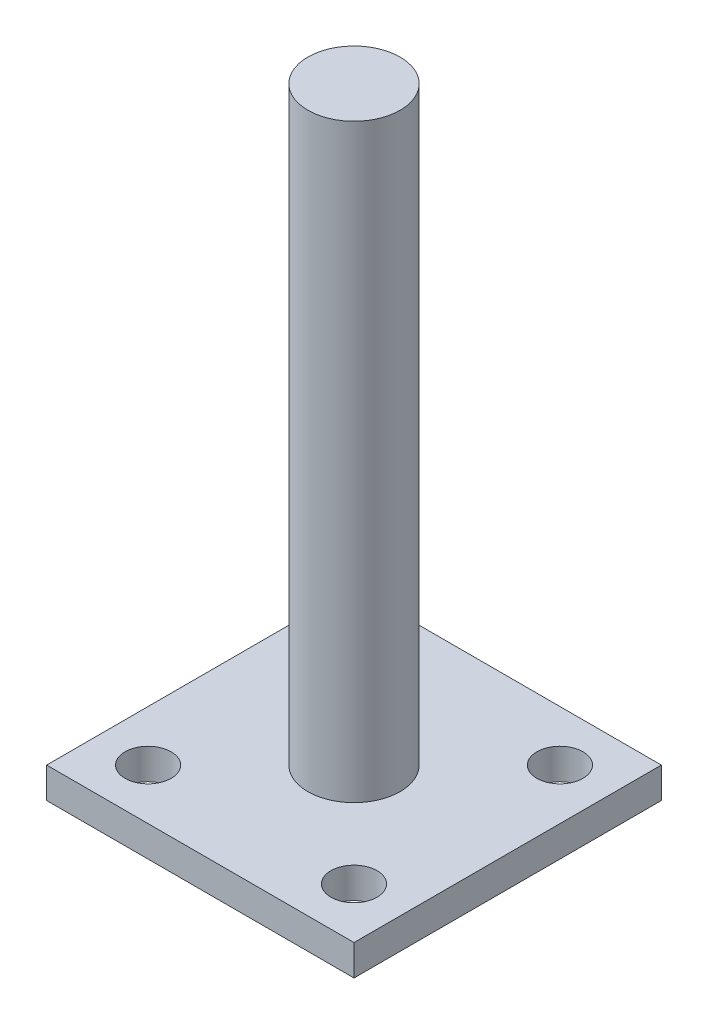
ISO-10303-21;
HEADER;
FILE_DESCRIPTION(('STEP AP214'),'2;1');
FILE_NAME('part.step','',(''),(''),'','','');
FILE_SCHEMA(('AUTOMOTIVE_DESIGN { 1 0 10303 214 1 1 1 1 }'));
ENDSEC;
DATA;
#1=APPLICATION_CONTEXT('core data for automotive mechanical design processes');
#2=APPLICATION_PROTOCOL_DEFINITION('international standard','automotive_design',2000,#1);
#3=PRODUCT_CONTEXT('',#1,'mechanical');
#4=PRODUCT('Part','Part','',(#3));
#5=PRODUCT_RELATED_PRODUCT_CATEGORY('part','',(#4));
#6=PRODUCT_DEFINITION_FORMATION('','',#4);
#7=PRODUCT_DEFINITION_CONTEXT('part definition',#1,'design');
#8=PRODUCT_DEFINITION('design','',#6,#7);
#9=PRODUCT_DEFINITION_SHAPE('','',#8);
#10=(LENGTH_UNIT() NAMED_UNIT(*) SI_UNIT(.MILLI.,.METRE.));
#11=(NAMED_UNIT(*) PLANE_ANGLE_UNIT() SI_UNIT($,.RADIAN.));
#12=(NAMED_UNIT(*) SI_UNIT($,.STERADIAN.) SOLID_ANGLE_UNIT());
#13=UNCERTAINTY_MEASURE_WITH_UNIT(LENGTH_MEASURE(1.E-05),#10,'distance_accuracy_value','');
#14=(GEOMETRIC_REPRESENTATION_CONTEXT(3) GLOBAL_UNCERTAINTY_ASSIGNED_CONTEXT((#13)) GLOBAL_UNIT_ASSIGNED_CONTEXT((#10,
#11,#12)) REPRESENTATION_CONTEXT('',''));
#15=CARTESIAN_POINT('',(0.,0.,0.));
#16=DIRECTION('',(0.,0.,1.));
#17=DIRECTION('',(1.,0.,0.));
#18=AXIS2_PLACEMENT_3D('',#15,#16,#17);
#19=CARTESIAN_POINT('',(0.,10.,0.));
#20=DIRECTION('',(0.,-1.,0.));
#21=DIRECTION('',(0.,0.,-1.));
#22=AXIS2_PLACEMENT_3D('',#19,#20,#21);
#23=PLANE('',#22);
#24=CARTESIAN_POINT('',(0.,10.,0.));
#25=DIRECTION('',(0.,1.,0.));
#26=DIRECTION('',(0.,0.,1.));
#27=AXIS2_PLACEMENT_3D('',#24,#25,#26);
#28=CIRCLE('',#27,15.);
#29=CARTESIAN_POINT('',(0.,10.,15.));
#30=VERTEX_POINT('',#29);
#31=EDGE_CURVE('E11',#30,#30,#28,.T.);
#32=ORIENTED_EDGE('',*,*,#31,.F.);
#33=EDGE_LOOP('',(#32));
#34=FACE_BOUND('',#33,.T.);
#35=DIRECTION('',(0.,0.,1.));
#36=VECTOR('',#35,1.);
#37=CARTESIAN_POINT('',(-50.,10.,-50.));
#38=LINE('',#37,#36);
#39=CARTESIAN_POINT('',(-50.,10.,-50.));
#40=VERTEX_POINT('',#39);
#41=CARTESIAN_POINT('',(-50.,10.,50.));
#42=VERTEX_POINT('',#41);
#43=EDGE_CURVE('E91',#40,#42,#38,.T.);
#44=ORIENTED_EDGE('',*,*,#43,.T.);
#45=DIRECTION('',(1.,0.,0.));
#46=VECTOR('',#45,1.);
#47=CARTESIAN_POINT('',(50.,10.,50.));
#48=LINE('',#47,#46);
#49=CARTESIAN_POINT('',(50.,10.,50.));
#50=VERTEX_POINT('',#49);
#51=EDGE_CURVE('E86',#42,#50,#48,.T.);
#52=ORIENTED_EDGE('',*,*,#51,.T.);
#53=DIRECTION('',(0.,0.,-1.));
#54=VECTOR('',#53,1.);
#55=CARTESIAN_POINT('',(50.,10.,-50.));
#56=LINE('',#55,#54);
#57=CARTESIAN_POINT('',(50.,10.,-50.));
#58=VERTEX_POINT('',#57);
#59=EDGE_CURVE('E89',#50,#58,#56,.T.);
#60=ORIENTED_EDGE('',*,*,#59,.T.);
#61=DIRECTION('',(-1.,0.,0.));
#62=VECTOR('',#61,1.);
#63=CARTESIAN_POINT('',(50.,10.,-50.));
#64=LINE('',#63,#62);
#65=EDGE_CURVE('E55',#58,#40,#64,.T.);
#66=ORIENTED_EDGE('',*,*,#65,.T.);
#67=EDGE_LOOP('',(#44,#52,#60,#66));
#68=FACE_BOUND('',#67,.T.);
#69=CARTESIAN_POINT('',(33.5,10.,-33.5));
#70=DIRECTION('',(0.,1.,0.));
#71=DIRECTION('',(0.,0.,1.));
#72=AXIS2_PLACEMENT_3D('',#69,#70,#71);
#73=CIRCLE('',#72,7.5);
#74=CARTESIAN_POINT('',(33.5,10.,-26.));
#75=VERTEX_POINT('',#74);
#76=EDGE_CURVE('E107',#75,#75,#73,.T.);
#77=ORIENTED_EDGE('',*,*,#76,.F.);
#78=EDGE_LOOP('',(#77));
#79=FACE_BOUND('',#78,.T.);
#80=CARTESIAN_POINT('',(-33.5,10.,-33.5));
#81=DIRECTION('',(0.,1.,0.));
#82=DIRECTION('',(0.,0.,1.));
#83=AXIS2_PLACEMENT_3D('',#80,#81,#82);
#84=CIRCLE('',#83,7.5);
#85=CARTESIAN_POINT('',(-33.5,10.,-26.));
#86=VERTEX_POINT('',#85);
#87=EDGE_CURVE('E122',#86,#86,#84,.T.);
#88=ORIENTED_EDGE('',*,*,#87,.F.);
#89=EDGE_LOOP('',(#88));
#90=FACE_BOUND('',#89,.T.);
#91=CARTESIAN_POINT('',(-33.5,10.,33.5));
#92=DIRECTION('',(0.,1.,0.));
#93=DIRECTION('',(0.,0.,1.));
#94=AXIS2_PLACEMENT_3D('',#91,#92,#93);
#95=CIRCLE('',#94,7.5);
#96=CARTESIAN_POINT('',(-33.5,10.,41.));
#97=VERTEX_POINT('',#96);
#98=EDGE_CURVE('E128',#97,#97,#95,.T.);
#99=ORIENTED_EDGE('',*,*,#98,.F.);
#100=EDGE_LOOP('',(#99));
#101=FACE_BOUND('',#100,.T.);
#102=CARTESIAN_POINT('',(33.5,10.,33.5));
#103=DIRECTION('',(0.,1.,0.));
#104=DIRECTION('',(0.,0.,1.));
#105=AXIS2_PLACEMENT_3D('',#102,#103,#104);
#106=CIRCLE('',#105,7.5);
#107=CARTESIAN_POINT('',(33.5,10.,41.));
#108=VERTEX_POINT('',#107);
#109=EDGE_CURVE('E134',#108,#108,#106,.T.);
#110=ORIENTED_EDGE('',*,*,#109,.F.);
#111=EDGE_LOOP('',(#110));
#112=FACE_BOUND('',#111,.T.);
#113=ADVANCED_FACE('F37',(#34,#68,#79,#90,#101,#112),#23,.F.);
#114=CARTESIAN_POINT('',(0.,0.,0.));
#115=DIRECTION('',(0.,-1.,0.));
#116=DIRECTION('',(0.,0.,-1.));
#117=AXIS2_PLACEMENT_3D('',#114,#115,#116);
#118=PLANE('',#117);
#119=CARTESIAN_POINT('',(-33.5,0.,33.5));
#120=DIRECTION('',(0.,1.,0.));
#121=DIRECTION('',(0.,0.,1.));
#122=AXIS2_PLACEMENT_3D('',#119,#120,#121);
#123=CIRCLE('',#122,7.5);
#124=CARTESIAN_POINT('',(-33.5,0.,41.));
#125=VERTEX_POINT('',#124);
#126=EDGE_CURVE('E131',#125,#125,#123,.T.);
#127=ORIENTED_EDGE('',*,*,#126,.T.);
#128=EDGE_LOOP('',(#127));
#129=FACE_BOUND('',#128,.T.);
#130=CARTESIAN_POINT('',(33.5,0.,-33.5));
#131=DIRECTION('',(0.,1.,0.));
#132=DIRECTION('',(0.,0.,1.));
#133=AXIS2_PLACEMENT_3D('',#130,#131,#132);
#134=CIRCLE('',#133,7.5);
#135=CARTESIAN_POINT('',(33.5,0.,-26.));
#136=VERTEX_POINT('',#135);
#137=EDGE_CURVE('E119',#136,#136,#134,.T.);
#138=ORIENTED_EDGE('',*,*,#137,.T.);
#139=EDGE_LOOP('',(#138));
#140=FACE_BOUND('',#139,.T.);
#141=DIRECTION('',(0.,0.,1.));
#142=VECTOR('',#141,1.);
#143=CARTESIAN_POINT('',(-50.,0.,-50.));
#144=LINE('',#143,#142);
#145=CARTESIAN_POINT('',(-50.,0.,-50.));
#146=VERTEX_POINT('',#145);
#147=CARTESIAN_POINT('',(-50.,0.,50.));
#148=VERTEX_POINT('',#147);
#149=EDGE_CURVE('E104',#146,#148,#144,.T.);
#150=ORIENTED_EDGE('',*,*,#149,.F.);
#151=DIRECTION('',(-1.,0.,0.));
#152=VECTOR('',#151,1.);
#153=CARTESIAN_POINT('',(50.,0.,-50.));
#154=LINE('',#153,#152);
#155=CARTESIAN_POINT('',(50.,0.,-50.));
#156=VERTEX_POINT('',#155);
#157=EDGE_CURVE('E78',#156,#146,#154,.T.);
#158=ORIENTED_EDGE('',*,*,#157,.F.);
#159=DIRECTION('',(0.,0.,-1.));
#160=VECTOR('',#159,1.);
#161=CARTESIAN_POINT('',(50.,0.,-50.));
#162=LINE('',#161,#160);
#163=CARTESIAN_POINT('',(50.,0.,50.));
#164=VERTEX_POINT('',#163);
#165=EDGE_CURVE('E72',#164,#156,#162,.T.);
#166=ORIENTED_EDGE('',*,*,#165,.F.);
#167=DIRECTION('',(1.,0.,0.));
#168=VECTOR('',#167,1.);
#169=CARTESIAN_POINT('',(50.,0.,50.));
#170=LINE('',#169,#168);
#171=EDGE_CURVE('E96',#148,#164,#170,.T.);
#172=ORIENTED_EDGE('',*,*,#171,.F.);
#173=EDGE_LOOP('',(#150,#158,#166,#172));
#174=FACE_BOUND('',#173,.T.);
#175=CARTESIAN_POINT('',(-33.5,0.,-33.5));
#176=DIRECTION('',(0.,1.,0.));
#177=DIRECTION('',(0.,0.,1.));
#178=AXIS2_PLACEMENT_3D('',#175,#176,#177);
#179=CIRCLE('',#178,7.5);
#180=CARTESIAN_POINT('',(-33.5,0.,-26.));
#181=VERTEX_POINT('',#180);
#182=EDGE_CURVE('E125',#181,#181,#179,.T.);
#183=ORIENTED_EDGE('',*,*,#182,.T.);
#184=EDGE_LOOP('',(#183));
#185=FACE_BOUND('',#184,.T.);
#186=CARTESIAN_POINT('',(33.5,0.,33.5));
#187=DIRECTION('',(0.,1.,0.));
#188=DIRECTION('',(0.,0.,1.));
#189=AXIS2_PLACEMENT_3D('',#186,#187,#188);
#190=CIRCLE('',#189,7.5);
#191=CARTESIAN_POINT('',(33.5,0.,41.));
#192=VERTEX_POINT('',#191);
#193=EDGE_CURVE('E137',#192,#192,#190,.T.);
#194=ORIENTED_EDGE('',*,*,#193,.T.);
#195=EDGE_LOOP('',(#194));
#196=FACE_BOUND('',#195,.T.);
#197=ADVANCED_FACE('F115',(#129,#140,#174,#185,#196),#118,.T.);
#198=CARTESIAN_POINT('',(-50.,10.,-50.));
#199=DIRECTION('',(1.,0.,0.));
#200=DIRECTION('',(0.,0.,-1.));
#201=AXIS2_PLACEMENT_3D('',#198,#199,#200);
#202=PLANE('',#201);
#203=ORIENTED_EDGE('',*,*,#149,.T.);
#204=DIRECTION('',(0.,-1.,0.));
#205=VECTOR('',#204,1.);
#206=CARTESIAN_POINT('',(-50.,10.,50.));
#207=LINE('',#206,#205);
#208=EDGE_CURVE('E41',#42,#148,#207,.T.);
#209=ORIENTED_EDGE('',*,*,#208,.F.);
#210=ORIENTED_EDGE('',*,*,#43,.F.);
#211=DIRECTION('',(0.,-1.,0.));
#212=VECTOR('',#211,1.);
#213=CARTESIAN_POINT('',(-50.,10.,-50.));
#214=LINE('',#213,#212);
#215=EDGE_CURVE('E100',#40,#146,#214,.T.);
#216=ORIENTED_EDGE('',*,*,#215,.T.);
#217=EDGE_LOOP('',(#203,#209,#210,#216));
#218=FACE_BOUND('',#217,.T.);
#219=ADVANCED_FACE('F39',(#218),#202,.F.);
#220=CARTESIAN_POINT('',(50.,10.,50.));
#221=DIRECTION('',(0.,0.,-1.));
#222=DIRECTION('',(-1.,0.,0.));
#223=AXIS2_PLACEMENT_3D('',#220,#221,#222);
#224=PLANE('',#223);
#225=ORIENTED_EDGE('',*,*,#171,.T.);
#226=DIRECTION('',(0.,-1.,0.));
#227=VECTOR('',#226,1.);
#228=CARTESIAN_POINT('',(50.,10.,50.));
#229=LINE('',#228,#227);
#230=EDGE_CURVE('E94',#50,#164,#229,.T.);
#231=ORIENTED_EDGE('',*,*,#230,.F.);
#232=ORIENTED_EDGE('',*,*,#51,.F.);
#233=ORIENTED_EDGE('',*,*,#208,.T.);
#234=EDGE_LOOP('',(#225,#231,#232,#233));
#235=FACE_BOUND('',#234,.T.);
#236=ADVANCED_FACE('F95',(#235),#224,.F.);
#237=CARTESIAN_POINT('',(50.,10.,-50.));
#238=DIRECTION('',(-1.,0.,0.));
#239=DIRECTION('',(0.,0.,1.));
#240=AXIS2_PLACEMENT_3D('',#237,#238,#239);
#241=PLANE('',#240);
#242=ORIENTED_EDGE('',*,*,#165,.T.);
#243=DIRECTION('',(0.,-1.,0.));
#244=VECTOR('',#243,1.);
#245=CARTESIAN_POINT('',(50.,10.,-50.));
#246=LINE('',#245,#244);
#247=EDGE_CURVE('E97',#58,#156,#246,.T.);
#248=ORIENTED_EDGE('',*,*,#247,.F.);
#249=ORIENTED_EDGE('',*,*,#59,.F.);
#250=ORIENTED_EDGE('',*,*,#230,.T.);
#251=EDGE_LOOP('',(#242,#248,#249,#250));
#252=FACE_BOUND('',#251,.T.);
#253=ADVANCED_FACE('F98',(#252),#241,.F.);
#254=CARTESIAN_POINT('',(50.,10.,-50.));
#255=DIRECTION('',(0.,0.,1.));
#256=DIRECTION('',(1.,0.,0.));
#257=AXIS2_PLACEMENT_3D('',#254,#255,#256);
#258=PLANE('',#257);
#259=ORIENTED_EDGE('',*,*,#157,.T.);
#260=ORIENTED_EDGE('',*,*,#215,.F.);
#261=ORIENTED_EDGE('',*,*,#65,.F.);
#262=ORIENTED_EDGE('',*,*,#247,.T.);
#263=EDGE_LOOP('',(#259,#260,#261,#262));
#264=FACE_BOUND('',#263,.T.);
#265=ADVANCED_FACE('F112',(#264),#258,.F.);
#266=CARTESIAN_POINT('',(33.5,10.,-33.5));
#267=DIRECTION('',(0.,-1.,0.));
#268=DIRECTION('',(0.,0.,-1.));
#269=AXIS2_PLACEMENT_3D('',#266,#267,#268);
#270=CYLINDRICAL_SURFACE('',#269,7.5);
#271=ORIENTED_EDGE('',*,*,#76,.T.);
#272=EDGE_LOOP('',(#271));
#273=FACE_BOUND('',#272,.T.);
#274=ORIENTED_EDGE('',*,*,#137,.F.);
#275=EDGE_LOOP('',(#274));
#276=FACE_BOUND('',#275,.T.);
#277=ADVANCED_FACE('F163',(#273,#276),#270,.F.);
#278=CARTESIAN_POINT('',(-33.5,10.,-33.5));
#279=DIRECTION('',(0.,-1.,0.));
#280=DIRECTION('',(0.,0.,-1.));
#281=AXIS2_PLACEMENT_3D('',#278,#279,#280);
#282=CYLINDRICAL_SURFACE('',#281,7.5);
#283=ORIENTED_EDGE('',*,*,#87,.T.);
#284=EDGE_LOOP('',(#283));
#285=FACE_BOUND('',#284,.T.);
#286=ORIENTED_EDGE('',*,*,#182,.F.);
#287=EDGE_LOOP('',(#286));
#288=FACE_BOUND('',#287,.T.);
#289=ADVANCED_FACE('F220',(#285,#288),#282,.F.);
#290=CARTESIAN_POINT('',(-33.5,10.,33.5));
#291=DIRECTION('',(0.,-1.,0.));
#292=DIRECTION('',(0.,0.,-1.));
#293=AXIS2_PLACEMENT_3D('',#290,#291,#292);
#294=CYLINDRICAL_SURFACE('',#293,7.5);
#295=ORIENTED_EDGE('',*,*,#98,.T.);
#296=EDGE_LOOP('',(#295));
#297=FACE_BOUND('',#296,.T.);
#298=ORIENTED_EDGE('',*,*,#126,.F.);
#299=EDGE_LOOP('',(#298));
#300=FACE_BOUND('',#299,.T.);
#301=ADVANCED_FACE('F230',(#297,#300),#294,.F.);
#302=CARTESIAN_POINT('',(33.5,10.,33.5));
#303=DIRECTION('',(0.,-1.,0.));
#304=DIRECTION('',(0.,0.,-1.));
#305=AXIS2_PLACEMENT_3D('',#302,#303,#304);
#306=CYLINDRICAL_SURFACE('',#305,7.5);
#307=ORIENTED_EDGE('',*,*,#109,.T.);
#308=EDGE_LOOP('',(#307));
#309=FACE_BOUND('',#308,.T.);
#310=ORIENTED_EDGE('',*,*,#193,.F.);
#311=EDGE_LOOP('',(#310));
#312=FACE_BOUND('',#311,.T.);
#313=ADVANCED_FACE('F151',(#309,#312),#306,.F.);
#314=CARTESIAN_POINT('',(0.,202.,0.));
#315=DIRECTION('',(0.,-1.,0.));
#316=DIRECTION('',(0.,0.,-1.));
#317=AXIS2_PLACEMENT_3D('',#314,#315,#316);
#318=CYLINDRICAL_SURFACE('',#317,15.);
#319=CARTESIAN_POINT('',(0.,202.,0.));
#320=DIRECTION('',(0.,1.,0.));
#321=DIRECTION('',(0.,0.,1.));
#322=AXIS2_PLACEMENT_3D('',#319,#320,#321);
#323=CIRCLE('',#322,15.);
#324=CARTESIAN_POINT('',(0.,202.,15.));
#325=VERTEX_POINT('',#324);
#326=EDGE_CURVE('E140',#325,#325,#323,.T.);
#327=ORIENTED_EDGE('',*,*,#326,.F.);
#328=EDGE_LOOP('',(#327));
#329=FACE_BOUND('',#328,.T.);
#330=ORIENTED_EDGE('',*,*,#31,.T.);
#331=EDGE_LOOP('',(#330));
#332=FACE_BOUND('',#331,.T.);
#333=ADVANCED_FACE('F148',(#329,#332),#318,.T.);
#334=CARTESIAN_POINT('',(0.,202.,0.));
#335=DIRECTION('',(0.,1.,0.));
#336=DIRECTION('',(0.,0.,1.));
#337=AXIS2_PLACEMENT_3D('',#334,#335,#336);
#338=PLANE('',#337);
#339=ORIENTED_EDGE('',*,*,#326,.T.);
#340=EDGE_LOOP('',(#339));
#341=FACE_BOUND('',#340,.T.);
#342=ADVANCED_FACE('F146',(#341),#338,.T.);
#343=CLOSED_SHELL('',(#113,#197,#219,#236,#253,#265,#277,#289,#301,#313,#333,#342));
#344=MANIFOLD_SOLID_BREP('B2',#343);
#345=ADVANCED_BREP_SHAPE_REPRESENTATION('',(#18,#344),#14);
#346=SHAPE_DEFINITION_REPRESENTATION(#9,#345);
ENDSEC;
END-ISO-10303-21;
